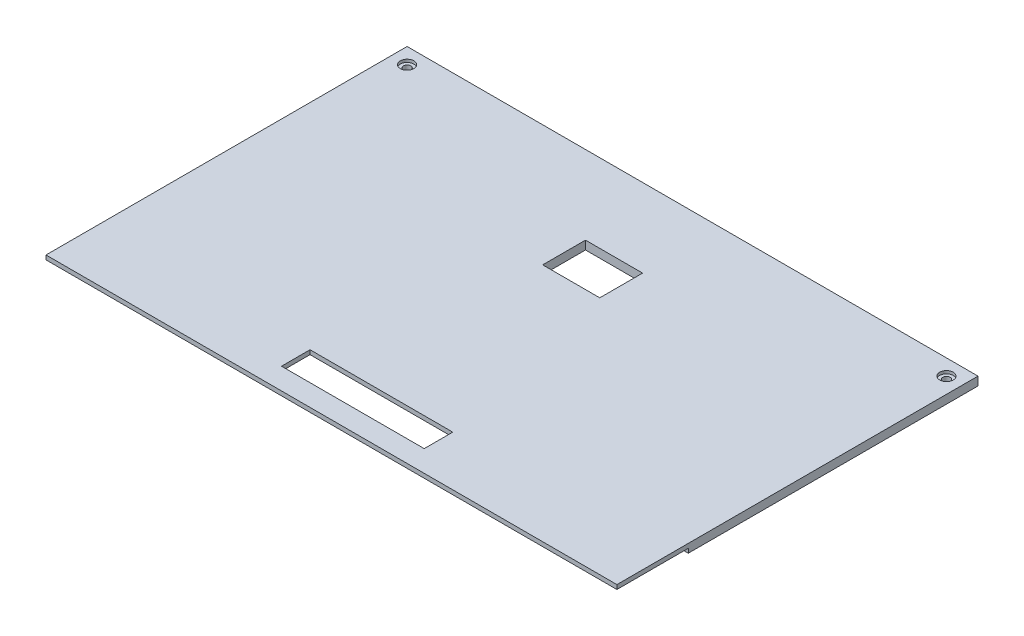
ISO-10303-21;
HEADER;
FILE_DESCRIPTION(('STEP AP214'),'2;1');
FILE_NAME('part.step','',(''),(''),'','','');
FILE_SCHEMA(('AUTOMOTIVE_DESIGN { 1 0 10303 214 1 1 1 1 }'));
ENDSEC;
DATA;
#1=APPLICATION_CONTEXT('core data for automotive mechanical design processes');
#2=APPLICATION_PROTOCOL_DEFINITION('international standard','automotive_design',2000,#1);
#3=PRODUCT_CONTEXT('',#1,'mechanical');
#4=PRODUCT('Part','Part','',(#3));
#5=PRODUCT_RELATED_PRODUCT_CATEGORY('part','',(#4));
#6=PRODUCT_DEFINITION_FORMATION('','',#4);
#7=PRODUCT_DEFINITION_CONTEXT('part definition',#1,'design');
#8=PRODUCT_DEFINITION('design','',#6,#7);
#9=PRODUCT_DEFINITION_SHAPE('','',#8);
#10=(LENGTH_UNIT() NAMED_UNIT(*) SI_UNIT(.MILLI.,.METRE.));
#11=(NAMED_UNIT(*) PLANE_ANGLE_UNIT() SI_UNIT($,.RADIAN.));
#12=(NAMED_UNIT(*) SI_UNIT($,.STERADIAN.) SOLID_ANGLE_UNIT());
#13=UNCERTAINTY_MEASURE_WITH_UNIT(LENGTH_MEASURE(1.E-05),#10,'distance_accuracy_value','');
#14=(GEOMETRIC_REPRESENTATION_CONTEXT(3) GLOBAL_UNCERTAINTY_ASSIGNED_CONTEXT((#13)) GLOBAL_UNIT_ASSIGNED_CONTEXT((#10,
#11,#12)) REPRESENTATION_CONTEXT('',''));
#15=CARTESIAN_POINT('',(0.,0.,0.));
#16=DIRECTION('',(0.,0.,1.));
#17=DIRECTION('',(1.,0.,0.));
#18=AXIS2_PLACEMENT_3D('',#15,#16,#17);
#19=CARTESIAN_POINT('',(0.,0.,-8.5));
#20=DIRECTION('',(0.,0.,1.));
#21=DIRECTION('',(1.,0.,0.));
#22=AXIS2_PLACEMENT_3D('',#19,#20,#21);
#23=PLANE('',#22);
#24=DIRECTION('',(0.,-1.,0.));
#25=VECTOR('',#24,1.);
#26=CARTESIAN_POINT('',(-100.,3.,-8.50000000000001));
#27=LINE('',#26,#25);
#28=CARTESIAN_POINT('',(-100.,3.,-8.50000000000001));
#29=VERTEX_POINT('',#28);
#30=CARTESIAN_POINT('',(-100.,1.5,-8.50000000000001));
#31=VERTEX_POINT('',#30);
#32=EDGE_CURVE('E194',#29,#31,#27,.T.);
#33=ORIENTED_EDGE('',*,*,#32,.T.);
#34=DIRECTION('',(-1.,0.,0.));
#35=VECTOR('',#34,1.);
#36=CARTESIAN_POINT('',(-100.,1.5,-8.50000000000001));
#37=LINE('',#36,#35);
#38=CARTESIAN_POINT('',(100.,1.5,-8.50000000000001));
#39=VERTEX_POINT('',#38);
#40=EDGE_CURVE('E181',#39,#31,#37,.T.);
#41=ORIENTED_EDGE('',*,*,#40,.F.);
#42=DIRECTION('',(0.,1.,0.));
#43=VECTOR('',#42,1.);
#44=CARTESIAN_POINT('',(100.,3.,-8.50000000000001));
#45=LINE('',#44,#43);
#46=CARTESIAN_POINT('',(100.,3.,-8.50000000000001));
#47=VERTEX_POINT('',#46);
#48=EDGE_CURVE('E282',#39,#47,#45,.T.);
#49=ORIENTED_EDGE('',*,*,#48,.T.);
#50=DIRECTION('',(-1.,0.,0.));
#51=VECTOR('',#50,1.);
#52=CARTESIAN_POINT('',(0.,3.,-8.5));
#53=LINE('',#52,#51);
#54=EDGE_CURVE('E188',#47,#29,#53,.T.);
#55=ORIENTED_EDGE('',*,*,#54,.T.);
#56=EDGE_LOOP('',(#33,#41,#49,#55));
#57=FACE_BOUND('',#56,.T.);
#58=ADVANCED_FACE('F33',(#57),#23,.T.);
#59=CARTESIAN_POINT('',(0.,0.,0.));
#60=DIRECTION('',(0.,-1.,0.));
#61=DIRECTION('',(0.,0.,-1.));
#62=AXIS2_PLACEMENT_3D('',#59,#60,#61);
#63=PLANE('',#62);
#64=CARTESIAN_POINT('',(6.25000000000001,0.,-88.4499999999999));
#65=DIRECTION('',(0.,-1.,0.));
#66=DIRECTION('',(0.,0.,-1.));
#67=AXIS2_PLACEMENT_3D('',#64,#65,#66);
#68=CIRCLE('',#67,1.75);
#69=CARTESIAN_POINT('',(6.25000000000001,0.,-90.1999999999999));
#70=VERTEX_POINT('',#69);
#71=EDGE_CURVE('E190',#70,#70,#68,.F.);
#72=ORIENTED_EDGE('',*,*,#71,.F.);
#73=EDGE_LOOP('',(#72));
#74=FACE_BOUND('',#73,.T.);
#75=ADVANCED_FACE('F332',(#74),#63,.T.);
#76=CARTESIAN_POINT('',(-3.89999999999999,0.,-120.15));
#77=DIRECTION('',(0.,-1.,0.));
#78=DIRECTION('',(0.,0.,-1.));
#79=AXIS2_PLACEMENT_3D('',#76,#77,#78);
#80=CIRCLE('',#79,1.75);
#81=CARTESIAN_POINT('',(-3.89999999999999,0.,-121.9));
#82=VERTEX_POINT('',#81);
#83=EDGE_CURVE('E193',#82,#82,#80,.F.);
#84=ORIENTED_EDGE('',*,*,#83,.F.);
#85=EDGE_LOOP('',(#84));
#86=FACE_BOUND('',#85,.T.);
#87=ADVANCED_FACE('F337',(#86),#63,.T.);
#88=CARTESIAN_POINT('',(6.25000000000001,-2.8,-88.4499999999999));
#89=DIRECTION('',(0.,1.,0.));
#90=DIRECTION('',(0.,0.,1.));
#91=AXIS2_PLACEMENT_3D('',#88,#89,#90);
#92=CYLINDRICAL_SURFACE('',#91,1.75);
#93=CARTESIAN_POINT('',(6.25000000000001,-2.8,-88.4499999999999));
#94=DIRECTION('',(0.,-1.,0.));
#95=DIRECTION('',(0.,0.,-1.));
#96=AXIS2_PLACEMENT_3D('',#93,#94,#95);
#97=CIRCLE('',#96,1.75);
#98=CARTESIAN_POINT('',(6.25000000000001,-2.8,-90.1999999999999));
#99=VERTEX_POINT('',#98);
#100=EDGE_CURVE('E11',#99,#99,#97,.T.);
#101=ORIENTED_EDGE('',*,*,#100,.T.);
#102=EDGE_LOOP('',(#101));
#103=FACE_BOUND('',#102,.T.);
#104=ORIENTED_EDGE('',*,*,#71,.T.);
#105=EDGE_LOOP('',(#104));
#106=FACE_BOUND('',#105,.T.);
#107=ADVANCED_FACE('F340',(#103,#106),#92,.F.);
#108=CARTESIAN_POINT('',(-3.89999999999999,-2.8,-120.15));
#109=DIRECTION('',(0.,1.,0.));
#110=DIRECTION('',(0.,0.,1.));
#111=AXIS2_PLACEMENT_3D('',#108,#109,#110);
#112=CYLINDRICAL_SURFACE('',#111,1.75);
#113=CARTESIAN_POINT('',(-3.89999999999999,-2.8,-120.15));
#114=DIRECTION('',(0.,-1.,0.));
#115=DIRECTION('',(0.,0.,-1.));
#116=AXIS2_PLACEMENT_3D('',#113,#114,#115);
#117=CIRCLE('',#116,1.75);
#118=CARTESIAN_POINT('',(-3.89999999999999,-2.8,-121.9));
#119=VERTEX_POINT('',#118);
#120=EDGE_CURVE('E270',#119,#119,#117,.T.);
#121=ORIENTED_EDGE('',*,*,#120,.T.);
#122=EDGE_LOOP('',(#121));
#123=FACE_BOUND('',#122,.T.);
#124=ORIENTED_EDGE('',*,*,#83,.T.);
#125=EDGE_LOOP('',(#124));
#126=FACE_BOUND('',#125,.T.);
#127=ADVANCED_FACE('F392',(#123,#126),#112,.F.);
#128=CARTESIAN_POINT('',(6.25000000000001,-2.8,-88.4499999999999));
#129=DIRECTION('',(0.,-1.,0.));
#130=DIRECTION('',(0.,0.,-1.));
#131=AXIS2_PLACEMENT_3D('',#128,#129,#130);
#132=PLANE('',#131);
#133=CARTESIAN_POINT('',(6.25000000000001,-2.8,-88.4499999999999));
#134=DIRECTION('',(0.,-1.,0.));
#135=DIRECTION('',(0.,0.,-1.));
#136=AXIS2_PLACEMENT_3D('',#133,#134,#135);
#137=CIRCLE('',#136,2.75);
#138=CARTESIAN_POINT('',(6.25000000000001,-2.8,-91.1999999999999));
#139=VERTEX_POINT('',#138);
#140=EDGE_CURVE('E275',#139,#139,#137,.T.);
#141=ORIENTED_EDGE('',*,*,#140,.T.);
#142=EDGE_LOOP('',(#141));
#143=FACE_BOUND('',#142,.T.);
#144=ORIENTED_EDGE('',*,*,#100,.F.);
#145=EDGE_LOOP('',(#144));
#146=FACE_BOUND('',#145,.T.);
#147=ADVANCED_FACE('F390',(#143,#146),#132,.T.);
#148=CARTESIAN_POINT('',(-3.89999999999999,-2.8,-120.15));
#149=DIRECTION('',(0.,-1.,0.));
#150=DIRECTION('',(0.,0.,-1.));
#151=AXIS2_PLACEMENT_3D('',#148,#149,#150);
#152=PLANE('',#151);
#153=CARTESIAN_POINT('',(-3.89999999999999,-2.8,-120.15));
#154=DIRECTION('',(0.,-1.,0.));
#155=DIRECTION('',(0.,0.,-1.));
#156=AXIS2_PLACEMENT_3D('',#153,#154,#155);
#157=CIRCLE('',#156,2.75);
#158=CARTESIAN_POINT('',(-3.89999999999999,-2.8,-122.9));
#159=VERTEX_POINT('',#158);
#160=EDGE_CURVE('E256',#159,#159,#157,.T.);
#161=ORIENTED_EDGE('',*,*,#160,.T.);
#162=EDGE_LOOP('',(#161));
#163=FACE_BOUND('',#162,.T.);
#164=ORIENTED_EDGE('',*,*,#120,.F.);
#165=EDGE_LOOP('',(#164));
#166=FACE_BOUND('',#165,.T.);
#167=ADVANCED_FACE('F366',(#163,#166),#152,.T.);
#168=CARTESIAN_POINT('',(94.474873734153,2.,-129.474873734153));
#169=DIRECTION('',(0.,1.,0.));
#170=DIRECTION('',(0.,0.,1.));
#171=AXIS2_PLACEMENT_3D('',#168,#169,#170);
#172=PLANE('',#171);
#173=CARTESIAN_POINT('',(94.474873734153,2.,-129.474873734153));
#174=DIRECTION('',(0.,1.,0.));
#175=DIRECTION('',(0.,0.,1.));
#176=AXIS2_PLACEMENT_3D('',#173,#174,#175);
#177=CIRCLE('',#176,2.375);
#178=CARTESIAN_POINT('',(94.474873734153,2.,-127.099873734153));
#179=VERTEX_POINT('',#178);
#180=EDGE_CURVE('E226',#179,#179,#177,.T.);
#181=ORIENTED_EDGE('',*,*,#180,.T.);
#182=EDGE_LOOP('',(#181));
#183=FACE_BOUND('',#182,.T.);
#184=CARTESIAN_POINT('',(94.474873734153,2.,-129.474873734153));
#185=DIRECTION('',(0.,1.,0.));
#186=DIRECTION('',(0.,0.,1.));
#187=AXIS2_PLACEMENT_3D('',#184,#185,#186);
#188=CIRCLE('',#187,1.29999999999999);
#189=CARTESIAN_POINT('',(94.474873734153,2.,-128.174873734153));
#190=VERTEX_POINT('',#189);
#191=EDGE_CURVE('E201',#190,#190,#188,.F.);
#192=ORIENTED_EDGE('',*,*,#191,.T.);
#193=EDGE_LOOP('',(#192));
#194=FACE_BOUND('',#193,.T.);
#195=ADVANCED_FACE('F326',(#183,#194),#172,.T.);
#196=CARTESIAN_POINT('',(-94.474873734153,2.,-129.474873734153));
#197=DIRECTION('',(0.,1.,0.));
#198=DIRECTION('',(0.,0.,1.));
#199=AXIS2_PLACEMENT_3D('',#196,#197,#198);
#200=PLANE('',#199);
#201=CARTESIAN_POINT('',(-94.474873734153,2.,-129.474873734153));
#202=DIRECTION('',(0.,1.,0.));
#203=DIRECTION('',(0.,0.,1.));
#204=AXIS2_PLACEMENT_3D('',#201,#202,#203);
#205=CIRCLE('',#204,2.375);
#206=CARTESIAN_POINT('',(-94.474873734153,2.,-127.099873734153));
#207=VERTEX_POINT('',#206);
#208=EDGE_CURVE('E205',#207,#207,#205,.T.);
#209=ORIENTED_EDGE('',*,*,#208,.T.);
#210=EDGE_LOOP('',(#209));
#211=FACE_BOUND('',#210,.T.);
#212=CARTESIAN_POINT('',(-94.474873734153,2.,-129.474873734153));
#213=DIRECTION('',(0.,1.,0.));
#214=DIRECTION('',(0.,0.,1.));
#215=AXIS2_PLACEMENT_3D('',#212,#213,#214);
#216=CIRCLE('',#215,1.29999999999999);
#217=CARTESIAN_POINT('',(-94.474873734153,2.,-128.174873734153));
#218=VERTEX_POINT('',#217);
#219=EDGE_CURVE('E198',#218,#218,#216,.F.);
#220=ORIENTED_EDGE('',*,*,#219,.T.);
#221=EDGE_LOOP('',(#220));
#222=FACE_BOUND('',#221,.T.);
#223=ADVANCED_FACE('F319',(#211,#222),#200,.T.);
#224=CARTESIAN_POINT('',(100.,3.,-135.));
#225=DIRECTION('',(0.,0.,1.));
#226=DIRECTION('',(1.,0.,0.));
#227=AXIS2_PLACEMENT_3D('',#224,#225,#226);
#228=PLANE('',#227);
#229=DIRECTION('',(-1.,0.,0.));
#230=VECTOR('',#229,1.);
#231=CARTESIAN_POINT('',(100.,0.,-135.));
#232=LINE('',#231,#230);
#233=CARTESIAN_POINT('',(100.,0.,-135.));
#234=VERTEX_POINT('',#233);
#235=CARTESIAN_POINT('',(-100.,0.,-135.));
#236=VERTEX_POINT('',#235);
#237=EDGE_CURVE('E212',#234,#236,#232,.T.);
#238=ORIENTED_EDGE('',*,*,#237,.T.);
#239=DIRECTION('',(0.,-1.,0.));
#240=VECTOR('',#239,1.);
#241=CARTESIAN_POINT('',(-100.,3.,-135.));
#242=LINE('',#241,#240);
#243=CARTESIAN_POINT('',(-100.,3.,-135.));
#244=VERTEX_POINT('',#243);
#245=EDGE_CURVE('E208',#244,#236,#242,.T.);
#246=ORIENTED_EDGE('',*,*,#245,.F.);
#247=DIRECTION('',(-1.,0.,0.));
#248=VECTOR('',#247,1.);
#249=CARTESIAN_POINT('',(100.,3.,-135.));
#250=LINE('',#249,#248);
#251=CARTESIAN_POINT('',(100.,3.,-135.));
#252=VERTEX_POINT('',#251);
#253=EDGE_CURVE('E211',#252,#244,#250,.T.);
#254=ORIENTED_EDGE('',*,*,#253,.F.);
#255=DIRECTION('',(0.,-1.,0.));
#256=VECTOR('',#255,1.);
#257=CARTESIAN_POINT('',(100.,3.,-135.));
#258=LINE('',#257,#256);
#259=EDGE_CURVE('E197',#252,#234,#258,.T.);
#260=ORIENTED_EDGE('',*,*,#259,.T.);
#261=EDGE_LOOP('',(#238,#246,#254,#260));
#262=FACE_BOUND('',#261,.T.);
#263=ADVANCED_FACE('F317',(#262),#228,.F.);
#264=CARTESIAN_POINT('',(-100.,3.,-135.));
#265=DIRECTION('',(1.,0.,0.));
#266=DIRECTION('',(0.,0.,-1.));
#267=AXIS2_PLACEMENT_3D('',#264,#265,#266);
#268=PLANE('',#267);
#269=DIRECTION('',(0.,0.,1.));
#270=VECTOR('',#269,1.);
#271=CARTESIAN_POINT('',(-100.,0.,-135.));
#272=LINE('',#271,#270);
#273=CARTESIAN_POINT('',(-100.,0.,-33.5));
#274=VERTEX_POINT('',#273);
#275=EDGE_CURVE('E37',#236,#274,#272,.T.);
#276=ORIENTED_EDGE('',*,*,#275,.T.);
#277=DIRECTION('',(0.,-1.,0.));
#278=VECTOR('',#277,1.);
#279=CARTESIAN_POINT('',(-100.,1.5,-33.5));
#280=LINE('',#279,#278);
#281=CARTESIAN_POINT('',(-100.,1.5,-33.5));
#282=VERTEX_POINT('',#281);
#283=EDGE_CURVE('E183',#282,#274,#280,.T.);
#284=ORIENTED_EDGE('',*,*,#283,.F.);
#285=DIRECTION('',(0.,0.,-1.));
#286=VECTOR('',#285,1.);
#287=CARTESIAN_POINT('',(-100.,1.5,-8.50000000000001));
#288=LINE('',#287,#286);
#289=EDGE_CURVE('E173',#31,#282,#288,.T.);
#290=ORIENTED_EDGE('',*,*,#289,.F.);
#291=ORIENTED_EDGE('',*,*,#32,.F.);
#292=DIRECTION('',(0.,0.,1.));
#293=VECTOR('',#292,1.);
#294=CARTESIAN_POINT('',(-100.,3.,-135.));
#295=LINE('',#294,#293);
#296=EDGE_CURVE('E215',#244,#29,#295,.T.);
#297=ORIENTED_EDGE('',*,*,#296,.F.);
#298=ORIENTED_EDGE('',*,*,#245,.T.);
#299=EDGE_LOOP('',(#276,#284,#290,#291,#297,#298));
#300=FACE_BOUND('',#299,.T.);
#301=ADVANCED_FACE('F294',(#300),#268,.F.);
#302=CARTESIAN_POINT('',(100.,3.,-135.));
#303=DIRECTION('',(-1.,0.,0.));
#304=DIRECTION('',(0.,0.,1.));
#305=AXIS2_PLACEMENT_3D('',#302,#303,#304);
#306=PLANE('',#305);
#307=DIRECTION('',(0.,0.,1.));
#308=VECTOR('',#307,1.);
#309=CARTESIAN_POINT('',(100.,1.5,-8.50000000000001));
#310=LINE('',#309,#308);
#311=CARTESIAN_POINT('',(100.,1.5,-33.5));
#312=VERTEX_POINT('',#311);
#313=EDGE_CURVE('E179',#312,#39,#310,.T.);
#314=ORIENTED_EDGE('',*,*,#313,.F.);
#315=DIRECTION('',(0.,-1.,0.));
#316=VECTOR('',#315,1.);
#317=CARTESIAN_POINT('',(100.,1.5,-33.5));
#318=LINE('',#317,#316);
#319=CARTESIAN_POINT('',(100.,0.,-33.5));
#320=VERTEX_POINT('',#319);
#321=EDGE_CURVE('E185',#312,#320,#318,.T.);
#322=ORIENTED_EDGE('',*,*,#321,.T.);
#323=DIRECTION('',(0.,0.,-1.));
#324=VECTOR('',#323,1.);
#325=CARTESIAN_POINT('',(100.,0.,-135.));
#326=LINE('',#325,#324);
#327=EDGE_CURVE('E214',#320,#234,#326,.T.);
#328=ORIENTED_EDGE('',*,*,#327,.T.);
#329=ORIENTED_EDGE('',*,*,#259,.F.);
#330=DIRECTION('',(0.,0.,-1.));
#331=VECTOR('',#330,1.);
#332=CARTESIAN_POINT('',(100.,3.,-135.));
#333=LINE('',#332,#331);
#334=EDGE_CURVE('E217',#47,#252,#333,.T.);
#335=ORIENTED_EDGE('',*,*,#334,.F.);
#336=ORIENTED_EDGE('',*,*,#48,.F.);
#337=EDGE_LOOP('',(#314,#322,#328,#329,#335,#336));
#338=FACE_BOUND('',#337,.T.);
#339=ADVANCED_FACE('F305',(#338),#306,.F.);
#340=CARTESIAN_POINT('',(6.25000000000001,-2.8,-88.4499999999999));
#341=DIRECTION('',(0.,1.,0.));
#342=DIRECTION('',(0.,0.,1.));
#343=AXIS2_PLACEMENT_3D('',#340,#341,#342);
#344=CYLINDRICAL_SURFACE('',#343,2.75);
#345=ORIENTED_EDGE('',*,*,#140,.F.);
#346=EDGE_LOOP('',(#345));
#347=FACE_BOUND('',#346,.T.);
#348=CARTESIAN_POINT('',(6.25000000000001,0.,-88.4499999999999));
#349=DIRECTION('',(0.,-1.,0.));
#350=DIRECTION('',(0.,0.,-1.));
#351=AXIS2_PLACEMENT_3D('',#348,#349,#350);
#352=CIRCLE('',#351,2.75);
#353=CARTESIAN_POINT('',(6.25000000000001,0.,-91.1999999999999));
#354=VERTEX_POINT('',#353);
#355=EDGE_CURVE('E42',#354,#354,#352,.T.);
#356=ORIENTED_EDGE('',*,*,#355,.T.);
#357=EDGE_LOOP('',(#356));
#358=FACE_BOUND('',#357,.T.);
#359=ADVANCED_FACE('F344',(#347,#358),#344,.T.);
#360=CARTESIAN_POINT('',(-3.89999999999999,-2.8,-120.15));
#361=DIRECTION('',(0.,1.,0.));
#362=DIRECTION('',(0.,0.,1.));
#363=AXIS2_PLACEMENT_3D('',#360,#361,#362);
#364=CYLINDRICAL_SURFACE('',#363,2.75);
#365=ORIENTED_EDGE('',*,*,#160,.F.);
#366=EDGE_LOOP('',(#365));
#367=FACE_BOUND('',#366,.T.);
#368=CARTESIAN_POINT('',(-3.89999999999999,0.,-120.15));
#369=DIRECTION('',(0.,-1.,0.));
#370=DIRECTION('',(0.,0.,-1.));
#371=AXIS2_PLACEMENT_3D('',#368,#369,#370);
#372=CIRCLE('',#371,2.75);
#373=CARTESIAN_POINT('',(-3.89999999999999,0.,-122.9));
#374=VERTEX_POINT('',#373);
#375=EDGE_CURVE('E267',#374,#374,#372,.T.);
#376=ORIENTED_EDGE('',*,*,#375,.T.);
#377=EDGE_LOOP('',(#376));
#378=FACE_BOUND('',#377,.T.);
#379=ADVANCED_FACE('F383',(#367,#378),#364,.T.);
#380=CARTESIAN_POINT('',(10.,0.,-107.5));
#381=DIRECTION('',(0.,0.,-1.));
#382=DIRECTION('',(-1.,0.,0.));
#383=AXIS2_PLACEMENT_3D('',#380,#381,#382);
#384=PLANE('',#383);
#385=DIRECTION('',(-1.,0.,0.));
#386=VECTOR('',#385,1.);
#387=CARTESIAN_POINT('',(10.,3.,-107.5));
#388=LINE('',#387,#386);
#389=CARTESIAN_POINT('',(10.,3.,-107.5));
#390=VERTEX_POINT('',#389);
#391=CARTESIAN_POINT('',(-10.,3.,-107.5));
#392=VERTEX_POINT('',#391);
#393=EDGE_CURVE('E244',#390,#392,#388,.T.);
#394=ORIENTED_EDGE('',*,*,#393,.T.);
#395=DIRECTION('',(0.,1.,0.));
#396=VECTOR('',#395,1.);
#397=CARTESIAN_POINT('',(-10.,0.,-107.5));
#398=LINE('',#397,#396);
#399=CARTESIAN_POINT('',(-10.,0.,-107.5));
#400=VERTEX_POINT('',#399);
#401=EDGE_CURVE('E232',#400,#392,#398,.T.);
#402=ORIENTED_EDGE('',*,*,#401,.F.);
#403=DIRECTION('',(-1.,0.,0.));
#404=VECTOR('',#403,1.);
#405=CARTESIAN_POINT('',(10.,0.,-107.5));
#406=LINE('',#405,#404);
#407=CARTESIAN_POINT('',(10.,0.,-107.5));
#408=VERTEX_POINT('',#407);
#409=EDGE_CURVE('E238',#408,#400,#406,.T.);
#410=ORIENTED_EDGE('',*,*,#409,.F.);
#411=DIRECTION('',(0.,1.,0.));
#412=VECTOR('',#411,1.);
#413=CARTESIAN_POINT('',(10.,0.,-107.5));
#414=LINE('',#413,#412);
#415=EDGE_CURVE('E241',#408,#390,#414,.T.);
#416=ORIENTED_EDGE('',*,*,#415,.T.);
#417=EDGE_LOOP('',(#394,#402,#410,#416));
#418=FACE_BOUND('',#417,.T.);
#419=ADVANCED_FACE('F379',(#418),#384,.F.);
#420=CARTESIAN_POINT('',(10.,0.,-107.5));
#421=DIRECTION('',(1.,0.,0.));
#422=DIRECTION('',(0.,0.,-1.));
#423=AXIS2_PLACEMENT_3D('',#420,#421,#422);
#424=PLANE('',#423);
#425=DIRECTION('',(0.,0.,-1.));
#426=VECTOR('',#425,1.);
#427=CARTESIAN_POINT('',(10.,3.,-107.5));
#428=LINE('',#427,#426);
#429=CARTESIAN_POINT('',(10.,3.,-92.5));
#430=VERTEX_POINT('',#429);
#431=EDGE_CURVE('E247',#430,#390,#428,.T.);
#432=ORIENTED_EDGE('',*,*,#431,.T.);
#433=ORIENTED_EDGE('',*,*,#415,.F.);
#434=DIRECTION('',(0.,0.,-1.));
#435=VECTOR('',#434,1.);
#436=CARTESIAN_POINT('',(10.,0.,-107.5));
#437=LINE('',#436,#435);
#438=CARTESIAN_POINT('',(10.,0.,-92.5));
#439=VERTEX_POINT('',#438);
#440=EDGE_CURVE('E259',#439,#408,#437,.T.);
#441=ORIENTED_EDGE('',*,*,#440,.F.);
#442=DIRECTION('',(0.,1.,0.));
#443=VECTOR('',#442,1.);
#444=CARTESIAN_POINT('',(10.,0.,-92.5));
#445=LINE('',#444,#443);
#446=EDGE_CURVE('E239',#439,#430,#445,.T.);
#447=ORIENTED_EDGE('',*,*,#446,.T.);
#448=EDGE_LOOP('',(#432,#433,#441,#447));
#449=FACE_BOUND('',#448,.T.);
#450=ADVANCED_FACE('F375',(#449),#424,.F.);
#451=CARTESIAN_POINT('',(10.,0.,-92.5));
#452=DIRECTION('',(0.,0.,1.));
#453=DIRECTION('',(1.,0.,0.));
#454=AXIS2_PLACEMENT_3D('',#451,#452,#453);
#455=PLANE('',#454);
#456=DIRECTION('',(1.,0.,0.));
#457=VECTOR('',#456,1.);
#458=CARTESIAN_POINT('',(10.,3.,-92.5));
#459=LINE('',#458,#457);
#460=CARTESIAN_POINT('',(-10.,3.,-92.5));
#461=VERTEX_POINT('',#460);
#462=EDGE_CURVE('E251',#461,#430,#459,.T.);
#463=ORIENTED_EDGE('',*,*,#462,.T.);
#464=ORIENTED_EDGE('',*,*,#446,.F.);
#465=DIRECTION('',(1.,0.,0.));
#466=VECTOR('',#465,1.);
#467=CARTESIAN_POINT('',(10.,0.,-92.5));
#468=LINE('',#467,#466);
#469=CARTESIAN_POINT('',(-10.,0.,-92.5));
#470=VERTEX_POINT('',#469);
#471=EDGE_CURVE('E262',#470,#439,#468,.T.);
#472=ORIENTED_EDGE('',*,*,#471,.F.);
#473=DIRECTION('',(0.,1.,0.));
#474=VECTOR('',#473,1.);
#475=CARTESIAN_POINT('',(-10.,0.,-92.5));
#476=LINE('',#475,#474);
#477=EDGE_CURVE('E235',#470,#461,#476,.T.);
#478=ORIENTED_EDGE('',*,*,#477,.T.);
#479=EDGE_LOOP('',(#463,#464,#472,#478));
#480=FACE_BOUND('',#479,.T.);
#481=ADVANCED_FACE('F371',(#480),#455,.F.);
#482=CARTESIAN_POINT('',(-10.,0.,-107.5));
#483=DIRECTION('',(-1.,0.,0.));
#484=DIRECTION('',(0.,0.,1.));
#485=AXIS2_PLACEMENT_3D('',#482,#483,#484);
#486=PLANE('',#485);
#487=DIRECTION('',(0.,0.,1.));
#488=VECTOR('',#487,1.);
#489=CARTESIAN_POINT('',(-10.,3.,-107.5));
#490=LINE('',#489,#488);
#491=EDGE_CURVE('E254',#392,#461,#490,.T.);
#492=ORIENTED_EDGE('',*,*,#491,.T.);
#493=ORIENTED_EDGE('',*,*,#477,.F.);
#494=DIRECTION('',(0.,0.,1.));
#495=VECTOR('',#494,1.);
#496=CARTESIAN_POINT('',(-10.,0.,-107.5));
#497=LINE('',#496,#495);
#498=EDGE_CURVE('E248',#400,#470,#497,.T.);
#499=ORIENTED_EDGE('',*,*,#498,.F.);
#500=ORIENTED_EDGE('',*,*,#401,.T.);
#501=EDGE_LOOP('',(#492,#493,#499,#500));
#502=FACE_BOUND('',#501,.T.);
#503=ADVANCED_FACE('F368',(#502),#486,.F.);
#504=CARTESIAN_POINT('',(94.474873734153,0.,-129.474873734153));
#505=DIRECTION('',(0.,1.,0.));
#506=DIRECTION('',(0.,0.,1.));
#507=AXIS2_PLACEMENT_3D('',#504,#505,#506);
#508=CYLINDRICAL_SURFACE('',#507,1.29999999999999);
#509=CARTESIAN_POINT('',(94.474873734153,0.,-129.474873734153));
#510=DIRECTION('',(0.,1.,0.));
#511=DIRECTION('',(0.,0.,-1.));
#512=AXIS2_PLACEMENT_3D('',#509,#510,#511);
#513=CIRCLE('',#512,1.29999999999999);
#514=CARTESIAN_POINT('',(94.474873734153,0.,-130.774873734153));
#515=VERTEX_POINT('',#514);
#516=EDGE_CURVE('E202',#515,#515,#513,.T.);
#517=ORIENTED_EDGE('',*,*,#516,.F.);
#518=EDGE_LOOP('',(#517));
#519=FACE_BOUND('',#518,.T.);
#520=ORIENTED_EDGE('',*,*,#191,.F.);
#521=EDGE_LOOP('',(#520));
#522=FACE_BOUND('',#521,.T.);
#523=ADVANCED_FACE('F362',(#519,#522),#508,.F.);
#524=CARTESIAN_POINT('',(-94.474873734153,0.,-129.474873734153));
#525=DIRECTION('',(0.,1.,0.));
#526=DIRECTION('',(0.,0.,1.));
#527=AXIS2_PLACEMENT_3D('',#524,#525,#526);
#528=CYLINDRICAL_SURFACE('',#527,1.29999999999999);
#529=CARTESIAN_POINT('',(-94.474873734153,0.,-129.474873734153));
#530=DIRECTION('',(0.,1.,0.));
#531=DIRECTION('',(0.,0.,1.));
#532=AXIS2_PLACEMENT_3D('',#529,#530,#531);
#533=CIRCLE('',#532,1.29999999999999);
#534=CARTESIAN_POINT('',(-94.474873734153,0.,-128.174873734153));
#535=VERTEX_POINT('',#534);
#536=EDGE_CURVE('E218',#535,#535,#533,.T.);
#537=ORIENTED_EDGE('',*,*,#536,.F.);
#538=EDGE_LOOP('',(#537));
#539=FACE_BOUND('',#538,.T.);
#540=ORIENTED_EDGE('',*,*,#219,.F.);
#541=EDGE_LOOP('',(#540));
#542=FACE_BOUND('',#541,.T.);
#543=ADVANCED_FACE('F417',(#539,#542),#528,.F.);
#544=DIRECTION('',(1.,0.,0.));
#545=VECTOR('',#544,1.);
#546=CARTESIAN_POINT('',(-100.,0.,-33.5));
#547=LINE('',#546,#545);
#548=EDGE_CURVE('E169',#274,#320,#547,.T.);
#549=ORIENTED_EDGE('',*,*,#548,.F.);
#550=ORIENTED_EDGE('',*,*,#275,.F.);
#551=ORIENTED_EDGE('',*,*,#237,.F.);
#552=ORIENTED_EDGE('',*,*,#327,.F.);
#553=EDGE_LOOP('',(#549,#550,#551,#552));
#554=FACE_BOUND('',#553,.T.);
#555=ORIENTED_EDGE('',*,*,#536,.T.);
#556=EDGE_LOOP('',(#555));
#557=FACE_BOUND('',#556,.T.);
#558=ORIENTED_EDGE('',*,*,#516,.T.);
#559=EDGE_LOOP('',(#558));
#560=FACE_BOUND('',#559,.T.);
#561=ORIENTED_EDGE('',*,*,#498,.T.);
#562=ORIENTED_EDGE('',*,*,#471,.T.);
#563=ORIENTED_EDGE('',*,*,#440,.T.);
#564=ORIENTED_EDGE('',*,*,#409,.T.);
#565=EDGE_LOOP('',(#561,#562,#563,#564));
#566=FACE_BOUND('',#565,.T.);
#567=ORIENTED_EDGE('',*,*,#375,.F.);
#568=EDGE_LOOP('',(#567));
#569=FACE_BOUND('',#568,.T.);
#570=ORIENTED_EDGE('',*,*,#355,.F.);
#571=EDGE_LOOP('',(#570));
#572=FACE_BOUND('',#571,.T.);
#573=ADVANCED_FACE('F35',(#554,#557,#560,#566,#569,#572),#63,.T.);
#574=CARTESIAN_POINT('',(94.474873734153,2.,-129.474873734153));
#575=DIRECTION('',(0.,1.,0.));
#576=DIRECTION('',(0.,0.,1.));
#577=AXIS2_PLACEMENT_3D('',#574,#575,#576);
#578=CYLINDRICAL_SURFACE('',#577,2.375);
#579=ORIENTED_EDGE('',*,*,#180,.F.);
#580=EDGE_LOOP('',(#579));
#581=FACE_BOUND('',#580,.T.);
#582=CARTESIAN_POINT('',(94.474873734153,3.,-129.474873734153));
#583=DIRECTION('',(0.,1.,0.));
#584=DIRECTION('',(0.,0.,1.));
#585=AXIS2_PLACEMENT_3D('',#582,#583,#584);
#586=CIRCLE('',#585,2.375);
#587=CARTESIAN_POINT('',(94.474873734153,3.,-127.099873734153));
#588=VERTEX_POINT('',#587);
#589=EDGE_CURVE('E229',#588,#588,#586,.T.);
#590=ORIENTED_EDGE('',*,*,#589,.T.);
#591=EDGE_LOOP('',(#590));
#592=FACE_BOUND('',#591,.T.);
#593=ADVANCED_FACE('F351',(#581,#592),#578,.F.);
#594=CARTESIAN_POINT('',(-94.474873734153,2.,-129.474873734153));
#595=DIRECTION('',(0.,1.,0.));
#596=DIRECTION('',(0.,0.,1.));
#597=AXIS2_PLACEMENT_3D('',#594,#595,#596);
#598=CYLINDRICAL_SURFACE('',#597,2.375);
#599=ORIENTED_EDGE('',*,*,#208,.F.);
#600=EDGE_LOOP('',(#599));
#601=FACE_BOUND('',#600,.T.);
#602=CARTESIAN_POINT('',(-94.474873734153,3.,-129.474873734153));
#603=DIRECTION('',(0.,1.,0.));
#604=DIRECTION('',(0.,0.,1.));
#605=AXIS2_PLACEMENT_3D('',#602,#603,#604);
#606=CIRCLE('',#605,2.375);
#607=CARTESIAN_POINT('',(-94.474873734153,3.,-127.099873734153));
#608=VERTEX_POINT('',#607);
#609=EDGE_CURVE('E223',#608,#608,#606,.T.);
#610=ORIENTED_EDGE('',*,*,#609,.T.);
#611=EDGE_LOOP('',(#610));
#612=FACE_BOUND('',#611,.T.);
#613=ADVANCED_FACE('F346',(#601,#612),#598,.F.);
#614=CARTESIAN_POINT('',(0.,3.,0.));
#615=DIRECTION('',(0.,-1.,0.));
#616=DIRECTION('',(0.,0.,-1.));
#617=AXIS2_PLACEMENT_3D('',#614,#615,#616);
#618=PLANE('',#617);
#619=DIRECTION('',(-1.,0.,0.));
#620=VECTOR('',#619,1.);
#621=CARTESIAN_POINT('',(25.,3.,-16.));
#622=LINE('',#621,#620);
#623=CARTESIAN_POINT('',(25.,3.,-16.));
#624=VERTEX_POINT('',#623);
#625=CARTESIAN_POINT('',(-25.,3.,-16.));
#626=VERTEX_POINT('',#625);
#627=EDGE_CURVE('E144',#624,#626,#622,.T.);
#628=ORIENTED_EDGE('',*,*,#627,.T.);
#629=DIRECTION('',(0.,0.,-1.));
#630=VECTOR('',#629,1.);
#631=CARTESIAN_POINT('',(-25.,3.,-16.));
#632=LINE('',#631,#630);
#633=CARTESIAN_POINT('',(-25.,3.,-26.));
#634=VERTEX_POINT('',#633);
#635=EDGE_CURVE('E138',#626,#634,#632,.T.);
#636=ORIENTED_EDGE('',*,*,#635,.T.);
#637=DIRECTION('',(1.,0.,0.));
#638=VECTOR('',#637,1.);
#639=CARTESIAN_POINT('',(25.,3.,-26.));
#640=LINE('',#639,#638);
#641=CARTESIAN_POINT('',(25.,3.,-26.));
#642=VERTEX_POINT('',#641);
#643=EDGE_CURVE('E147',#634,#642,#640,.T.);
#644=ORIENTED_EDGE('',*,*,#643,.T.);
#645=DIRECTION('',(0.,0.,1.));
#646=VECTOR('',#645,1.);
#647=CARTESIAN_POINT('',(25.,3.,-16.));
#648=LINE('',#647,#646);
#649=EDGE_CURVE('E50',#642,#624,#648,.T.);
#650=ORIENTED_EDGE('',*,*,#649,.T.);
#651=EDGE_LOOP('',(#628,#636,#644,#650));
#652=FACE_BOUND('',#651,.T.);
#653=ORIENTED_EDGE('',*,*,#609,.F.);
#654=EDGE_LOOP('',(#653));
#655=FACE_BOUND('',#654,.T.);
#656=ORIENTED_EDGE('',*,*,#589,.F.);
#657=EDGE_LOOP('',(#656));
#658=FACE_BOUND('',#657,.T.);
#659=ORIENTED_EDGE('',*,*,#462,.F.);
#660=ORIENTED_EDGE('',*,*,#491,.F.);
#661=ORIENTED_EDGE('',*,*,#393,.F.);
#662=ORIENTED_EDGE('',*,*,#431,.F.);
#663=EDGE_LOOP('',(#659,#660,#661,#662));
#664=FACE_BOUND('',#663,.T.);
#665=ORIENTED_EDGE('',*,*,#54,.F.);
#666=ORIENTED_EDGE('',*,*,#334,.T.);
#667=ORIENTED_EDGE('',*,*,#253,.T.);
#668=ORIENTED_EDGE('',*,*,#296,.T.);
#669=EDGE_LOOP('',(#665,#666,#667,#668));
#670=FACE_BOUND('',#669,.T.);
#671=ADVANCED_FACE('F151',(#652,#655,#658,#664,#670),#618,.F.);
#672=CARTESIAN_POINT('',(-100.,1.5,-33.5));
#673=DIRECTION('',(0.,0.,-1.));
#674=DIRECTION('',(-1.,0.,0.));
#675=AXIS2_PLACEMENT_3D('',#672,#673,#674);
#676=PLANE('',#675);
#677=ORIENTED_EDGE('',*,*,#548,.T.);
#678=ORIENTED_EDGE('',*,*,#321,.F.);
#679=DIRECTION('',(1.,0.,0.));
#680=VECTOR('',#679,1.);
#681=CARTESIAN_POINT('',(-100.,1.5,-33.5));
#682=LINE('',#681,#680);
#683=EDGE_CURVE('E176',#282,#312,#682,.T.);
#684=ORIENTED_EDGE('',*,*,#683,.F.);
#685=ORIENTED_EDGE('',*,*,#283,.T.);
#686=EDGE_LOOP('',(#677,#678,#684,#685));
#687=FACE_BOUND('',#686,.T.);
#688=ADVANCED_FACE('F303',(#687),#676,.F.);
#689=CARTESIAN_POINT('',(0.,1.5,0.));
#690=DIRECTION('',(0.,-1.,0.));
#691=DIRECTION('',(0.,0.,-1.));
#692=AXIS2_PLACEMENT_3D('',#689,#690,#691);
#693=PLANE('',#692);
#694=DIRECTION('',(0.,0.,-1.));
#695=VECTOR('',#694,1.);
#696=CARTESIAN_POINT('',(-25.,1.5,-16.));
#697=LINE('',#696,#695);
#698=CARTESIAN_POINT('',(-25.,1.5,-16.));
#699=VERTEX_POINT('',#698);
#700=CARTESIAN_POINT('',(-25.,1.5,-26.));
#701=VERTEX_POINT('',#700);
#702=EDGE_CURVE('E58',#699,#701,#697,.T.);
#703=ORIENTED_EDGE('',*,*,#702,.F.);
#704=DIRECTION('',(-1.,0.,0.));
#705=VECTOR('',#704,1.);
#706=CARTESIAN_POINT('',(25.,1.5,-16.));
#707=LINE('',#706,#705);
#708=CARTESIAN_POINT('',(25.,1.5,-16.));
#709=VERTEX_POINT('',#708);
#710=EDGE_CURVE('E154',#709,#699,#707,.T.);
#711=ORIENTED_EDGE('',*,*,#710,.F.);
#712=DIRECTION('',(0.,0.,1.));
#713=VECTOR('',#712,1.);
#714=CARTESIAN_POINT('',(25.,1.5,-16.));
#715=LINE('',#714,#713);
#716=CARTESIAN_POINT('',(25.,1.5,-26.));
#717=VERTEX_POINT('',#716);
#718=EDGE_CURVE('E157',#717,#709,#715,.T.);
#719=ORIENTED_EDGE('',*,*,#718,.F.);
#720=DIRECTION('',(1.,0.,0.));
#721=VECTOR('',#720,1.);
#722=CARTESIAN_POINT('',(25.,1.5,-26.));
#723=LINE('',#722,#721);
#724=EDGE_CURVE('E163',#701,#717,#723,.T.);
#725=ORIENTED_EDGE('',*,*,#724,.F.);
#726=EDGE_LOOP('',(#703,#711,#719,#725));
#727=FACE_BOUND('',#726,.T.);
#728=ORIENTED_EDGE('',*,*,#289,.T.);
#729=ORIENTED_EDGE('',*,*,#683,.T.);
#730=ORIENTED_EDGE('',*,*,#313,.T.);
#731=ORIENTED_EDGE('',*,*,#40,.T.);
#732=EDGE_LOOP('',(#728,#729,#730,#731));
#733=FACE_BOUND('',#732,.T.);
#734=ADVANCED_FACE('F310',(#727,#733),#693,.T.);
#735=CARTESIAN_POINT('',(-25.,3.,-16.));
#736=DIRECTION('',(-1.,0.,0.));
#737=DIRECTION('',(0.,0.,1.));
#738=AXIS2_PLACEMENT_3D('',#735,#736,#737);
#739=PLANE('',#738);
#740=ORIENTED_EDGE('',*,*,#702,.T.);
#741=DIRECTION('',(0.,-1.,0.));
#742=VECTOR('',#741,1.);
#743=CARTESIAN_POINT('',(-25.,3.,-26.));
#744=LINE('',#743,#742);
#745=EDGE_CURVE('E134',#634,#701,#744,.T.);
#746=ORIENTED_EDGE('',*,*,#745,.F.);
#747=ORIENTED_EDGE('',*,*,#635,.F.);
#748=DIRECTION('',(0.,-1.,0.));
#749=VECTOR('',#748,1.);
#750=CARTESIAN_POINT('',(-25.,3.,-16.));
#751=LINE('',#750,#749);
#752=EDGE_CURVE('E167',#626,#699,#751,.T.);
#753=ORIENTED_EDGE('',*,*,#752,.T.);
#754=EDGE_LOOP('',(#740,#746,#747,#753));
#755=FACE_BOUND('',#754,.T.);
#756=ADVANCED_FACE('F136',(#755),#739,.F.);
#757=CARTESIAN_POINT('',(25.,3.,-16.));
#758=DIRECTION('',(0.,0.,1.));
#759=DIRECTION('',(1.,0.,0.));
#760=AXIS2_PLACEMENT_3D('',#757,#758,#759);
#761=PLANE('',#760);
#762=ORIENTED_EDGE('',*,*,#710,.T.);
#763=ORIENTED_EDGE('',*,*,#752,.F.);
#764=ORIENTED_EDGE('',*,*,#627,.F.);
#765=DIRECTION('',(0.,-1.,0.));
#766=VECTOR('',#765,1.);
#767=CARTESIAN_POINT('',(25.,3.,-16.));
#768=LINE('',#767,#766);
#769=EDGE_CURVE('E170',#624,#709,#768,.T.);
#770=ORIENTED_EDGE('',*,*,#769,.T.);
#771=EDGE_LOOP('',(#762,#763,#764,#770));
#772=FACE_BOUND('',#771,.T.);
#773=ADVANCED_FACE('F538',(#772),#761,.F.);
#774=CARTESIAN_POINT('',(25.,3.,-16.));
#775=DIRECTION('',(1.,0.,0.));
#776=DIRECTION('',(0.,0.,-1.));
#777=AXIS2_PLACEMENT_3D('',#774,#775,#776);
#778=PLANE('',#777);
#779=ORIENTED_EDGE('',*,*,#718,.T.);
#780=ORIENTED_EDGE('',*,*,#769,.F.);
#781=ORIENTED_EDGE('',*,*,#649,.F.);
#782=DIRECTION('',(0.,-1.,0.));
#783=VECTOR('',#782,1.);
#784=CARTESIAN_POINT('',(25.,3.,-26.));
#785=LINE('',#784,#783);
#786=EDGE_CURVE('E143',#642,#717,#785,.T.);
#787=ORIENTED_EDGE('',*,*,#786,.T.);
#788=EDGE_LOOP('',(#779,#780,#781,#787));
#789=FACE_BOUND('',#788,.T.);
#790=ADVANCED_FACE('F547',(#789),#778,.F.);
#791=CARTESIAN_POINT('',(25.,3.,-26.));
#792=DIRECTION('',(0.,0.,-1.));
#793=DIRECTION('',(-1.,0.,0.));
#794=AXIS2_PLACEMENT_3D('',#791,#792,#793);
#795=PLANE('',#794);
#796=ORIENTED_EDGE('',*,*,#724,.T.);
#797=ORIENTED_EDGE('',*,*,#786,.F.);
#798=ORIENTED_EDGE('',*,*,#643,.F.);
#799=ORIENTED_EDGE('',*,*,#745,.T.);
#800=EDGE_LOOP('',(#796,#797,#798,#799));
#801=FACE_BOUND('',#800,.T.);
#802=ADVANCED_FACE('F148',(#801),#795,.F.);
#803=CLOSED_SHELL('',(#58,#75,#87,#107,#127,#147,#167,#195,#223,#263,#301,#339,#359,#379,#419,
#450,#481,#503,#523,#543,#573,#593,#613,#671,#688,#734,#756,#773,#790,#802));
#804=MANIFOLD_SOLID_BREP('B2',#803);
#805=ADVANCED_BREP_SHAPE_REPRESENTATION('',(#18,#804),#14);
#806=SHAPE_DEFINITION_REPRESENTATION(#9,#805);
ENDSEC;
END-ISO-10303-21;
